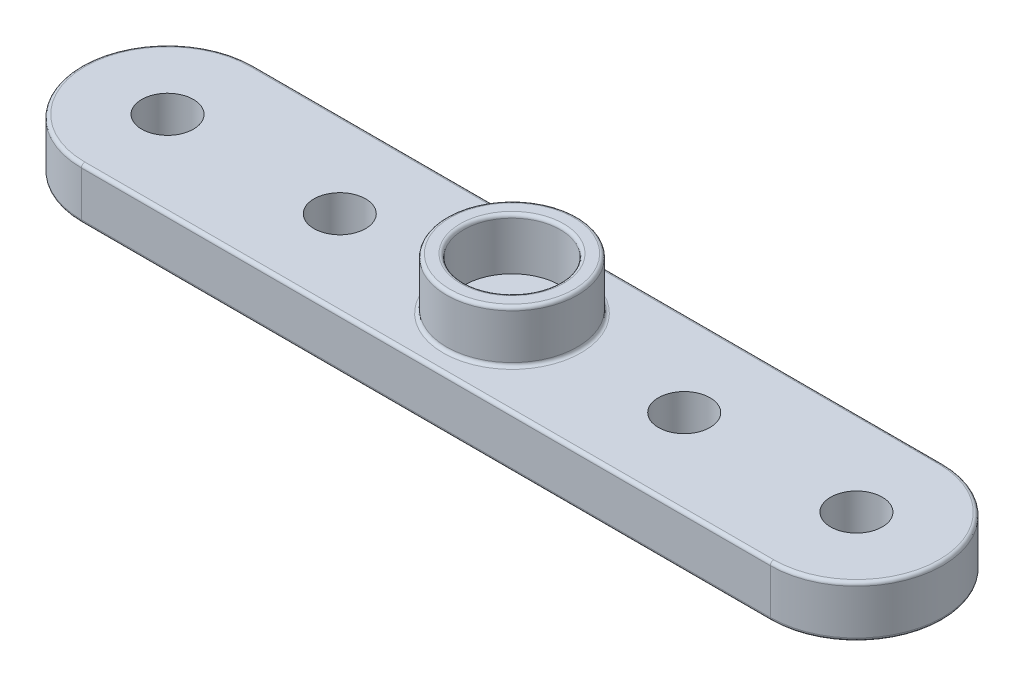
ISO-10303-21;
HEADER;
FILE_DESCRIPTION(('STEP AP214'),'2;1');
FILE_NAME('part.step','',(''),(''),'','','');
FILE_SCHEMA(('AUTOMOTIVE_DESIGN { 1 0 10303 214 1 1 1 1 }'));
ENDSEC;
DATA;
#1=APPLICATION_CONTEXT('core data for automotive mechanical design processes');
#2=APPLICATION_PROTOCOL_DEFINITION('international standard','automotive_design',2000,#1);
#3=PRODUCT_CONTEXT('',#1,'mechanical');
#4=PRODUCT('Part','Part','',(#3));
#5=PRODUCT_RELATED_PRODUCT_CATEGORY('part','',(#4));
#6=PRODUCT_DEFINITION_FORMATION('','',#4);
#7=PRODUCT_DEFINITION_CONTEXT('part definition',#1,'design');
#8=PRODUCT_DEFINITION('design','',#6,#7);
#9=PRODUCT_DEFINITION_SHAPE('','',#8);
#10=(LENGTH_UNIT() NAMED_UNIT(*) SI_UNIT(.MILLI.,.METRE.));
#11=(NAMED_UNIT(*) PLANE_ANGLE_UNIT() SI_UNIT($,.RADIAN.));
#12=(NAMED_UNIT(*) SI_UNIT($,.STERADIAN.) SOLID_ANGLE_UNIT());
#13=UNCERTAINTY_MEASURE_WITH_UNIT(LENGTH_MEASURE(1.E-05),#10,'distance_accuracy_value','');
#14=(GEOMETRIC_REPRESENTATION_CONTEXT(3) GLOBAL_UNCERTAINTY_ASSIGNED_CONTEXT((#13)) GLOBAL_UNIT_ASSIGNED_CONTEXT((#10,
#11,#12)) REPRESENTATION_CONTEXT('',''));
#15=CARTESIAN_POINT('',(0.,0.,0.));
#16=DIRECTION('',(0.,0.,1.));
#17=DIRECTION('',(1.,0.,0.));
#18=AXIS2_PLACEMENT_3D('',#15,#16,#17);
#19=CARTESIAN_POINT('',(20.,0.,0.));
#20=DIRECTION('',(0.,-1.,0.));
#21=DIRECTION('',(0.,0.,-1.));
#22=AXIS2_PLACEMENT_3D('',#19,#20,#21);
#23=CYLINDRICAL_SURFACE('',#22,5.);
#24=DIRECTION('',(0.,-1.,0.));
#25=VECTOR('',#24,1.);
#26=CARTESIAN_POINT('',(20.,3.,-5.));
#27=LINE('',#26,#25);
#28=CARTESIAN_POINT('',(20.,2.8,-5.));
#29=VERTEX_POINT('',#28);
#30=CARTESIAN_POINT('',(20.,0.2,-5.));
#31=VERTEX_POINT('',#30);
#32=EDGE_CURVE('E234',#29,#31,#27,.T.);
#33=ORIENTED_EDGE('',*,*,#32,.F.);
#34=CARTESIAN_POINT('',(20.,2.8,0.));
#35=DIRECTION('',(0.,1.,0.));
#36=DIRECTION('',(0.,0.,1.));
#37=AXIS2_PLACEMENT_3D('',#34,#35,#36);
#38=CIRCLE('',#37,5.);
#39=CARTESIAN_POINT('',(20.,2.8,5.));
#40=VERTEX_POINT('',#39);
#41=EDGE_CURVE('E165',#29,#40,#38,.F.);
#42=ORIENTED_EDGE('',*,*,#41,.T.);
#43=DIRECTION('',(0.,-1.,0.));
#44=VECTOR('',#43,1.);
#45=CARTESIAN_POINT('',(20.,3.,5.));
#46=LINE('',#45,#44);
#47=CARTESIAN_POINT('',(20.,0.2,5.));
#48=VERTEX_POINT('',#47);
#49=EDGE_CURVE('E237',#48,#40,#46,.F.);
#50=ORIENTED_EDGE('',*,*,#49,.F.);
#51=CARTESIAN_POINT('',(20.,0.2,0.));
#52=DIRECTION('',(0.,1.,0.));
#53=DIRECTION('',(0.,0.,1.));
#54=AXIS2_PLACEMENT_3D('',#51,#52,#53);
#55=CIRCLE('',#54,5.);
#56=EDGE_CURVE('E162',#48,#31,#55,.T.);
#57=ORIENTED_EDGE('',*,*,#56,.T.);
#58=EDGE_LOOP('',(#33,#42,#50,#57));
#59=FACE_BOUND('',#58,.T.);
#60=ADVANCED_FACE('F41',(#59),#23,.T.);
#61=CARTESIAN_POINT('',(-20.,0.,0.));
#62=DIRECTION('',(0.,-1.,0.));
#63=DIRECTION('',(0.,0.,-1.));
#64=AXIS2_PLACEMENT_3D('',#61,#62,#63);
#65=CYLINDRICAL_SURFACE('',#64,5.);
#66=DIRECTION('',(0.,-1.,0.));
#67=VECTOR('',#66,1.);
#68=CARTESIAN_POINT('',(-20.,3.,5.));
#69=LINE('',#68,#67);
#70=CARTESIAN_POINT('',(-20.,2.8,5.));
#71=VERTEX_POINT('',#70);
#72=CARTESIAN_POINT('',(-20.,0.2,5.));
#73=VERTEX_POINT('',#72);
#74=EDGE_CURVE('E249',#71,#73,#69,.T.);
#75=ORIENTED_EDGE('',*,*,#74,.F.);
#76=CARTESIAN_POINT('',(-20.,2.8,0.));
#77=DIRECTION('',(0.,1.,0.));
#78=DIRECTION('',(0.,0.,1.));
#79=AXIS2_PLACEMENT_3D('',#76,#77,#78);
#80=CIRCLE('',#79,5.);
#81=CARTESIAN_POINT('',(-20.,2.8,-5.));
#82=VERTEX_POINT('',#81);
#83=EDGE_CURVE('E118',#71,#82,#80,.F.);
#84=ORIENTED_EDGE('',*,*,#83,.T.);
#85=DIRECTION('',(0.,-1.,0.));
#86=VECTOR('',#85,1.);
#87=CARTESIAN_POINT('',(-20.,3.,-5.));
#88=LINE('',#87,#86);
#89=CARTESIAN_POINT('',(-20.,0.2,-5.));
#90=VERTEX_POINT('',#89);
#91=EDGE_CURVE('E261',#90,#82,#88,.F.);
#92=ORIENTED_EDGE('',*,*,#91,.F.);
#93=CARTESIAN_POINT('',(-20.,0.2,0.));
#94=DIRECTION('',(0.,1.,0.));
#95=DIRECTION('',(0.,0.,1.));
#96=AXIS2_PLACEMENT_3D('',#93,#94,#95);
#97=CIRCLE('',#96,5.);
#98=EDGE_CURVE('E146',#90,#73,#97,.T.);
#99=ORIENTED_EDGE('',*,*,#98,.T.);
#100=EDGE_LOOP('',(#75,#84,#92,#99));
#101=FACE_BOUND('',#100,.T.);
#102=ADVANCED_FACE('F260',(#101),#65,.T.);
#103=CARTESIAN_POINT('',(0.,3.,0.));
#104=DIRECTION('',(0.,1.,0.));
#105=DIRECTION('',(0.,0.,1.));
#106=AXIS2_PLACEMENT_3D('',#103,#104,#105);
#107=PLANE('',#106);
#108=CARTESIAN_POINT('',(0.,3.,0.));
#109=DIRECTION('',(0.,1.,0.));
#110=DIRECTION('',(0.,0.,1.));
#111=AXIS2_PLACEMENT_3D('',#108,#109,#110);
#112=CIRCLE('',#111,4.);
#113=CARTESIAN_POINT('',(0.,3.,4.));
#114=VERTEX_POINT('',#113);
#115=EDGE_CURVE('E141',#114,#114,#112,.F.);
#116=ORIENTED_EDGE('',*,*,#115,.T.);
#117=EDGE_LOOP('',(#116));
#118=FACE_BOUND('',#117,.T.);
#119=DIRECTION('',(-1.,0.,0.));
#120=VECTOR('',#119,1.);
#121=CARTESIAN_POINT('',(-20.,3.,-4.8));
#122=LINE('',#121,#120);
#123=CARTESIAN_POINT('',(20.,3.,-4.8));
#124=VERTEX_POINT('',#123);
#125=CARTESIAN_POINT('',(-20.,3.,-4.8));
#126=VERTEX_POINT('',#125);
#127=EDGE_CURVE('E138',#124,#126,#122,.T.);
#128=ORIENTED_EDGE('',*,*,#127,.T.);
#129=CARTESIAN_POINT('',(-20.,3.,0.));
#130=DIRECTION('',(0.,1.,0.));
#131=DIRECTION('',(0.,0.,1.));
#132=AXIS2_PLACEMENT_3D('',#129,#130,#131);
#133=CIRCLE('',#132,4.8);
#134=CARTESIAN_POINT('',(-20.,3.,4.8));
#135=VERTEX_POINT('',#134);
#136=EDGE_CURVE('E116',#126,#135,#133,.T.);
#137=ORIENTED_EDGE('',*,*,#136,.T.);
#138=DIRECTION('',(1.,0.,0.));
#139=VECTOR('',#138,1.);
#140=CARTESIAN_POINT('',(20.,3.,4.8));
#141=LINE('',#140,#139);
#142=CARTESIAN_POINT('',(20.,3.,4.8));
#143=VERTEX_POINT('',#142);
#144=EDGE_CURVE('E125',#135,#143,#141,.T.);
#145=ORIENTED_EDGE('',*,*,#144,.T.);
#146=CARTESIAN_POINT('',(20.,3.,0.));
#147=DIRECTION('',(0.,1.,0.));
#148=DIRECTION('',(0.,0.,1.));
#149=AXIS2_PLACEMENT_3D('',#146,#147,#148);
#150=CIRCLE('',#149,4.8);
#151=EDGE_CURVE('E132',#143,#124,#150,.T.);
#152=ORIENTED_EDGE('',*,*,#151,.T.);
#153=EDGE_LOOP('',(#128,#137,#145,#152));
#154=FACE_BOUND('',#153,.T.);
#155=CARTESIAN_POINT('',(10.,3.,0.));
#156=DIRECTION('',(0.,1.,0.));
#157=DIRECTION('',(0.,0.,-1.));
#158=AXIS2_PLACEMENT_3D('',#155,#156,#157);
#159=CIRCLE('',#158,1.5);
#160=CARTESIAN_POINT('',(10.,3.,-1.5));
#161=VERTEX_POINT('',#160);
#162=EDGE_CURVE('E280',#161,#161,#159,.T.);
#163=ORIENTED_EDGE('',*,*,#162,.F.);
#164=EDGE_LOOP('',(#163));
#165=FACE_BOUND('',#164,.T.);
#166=CARTESIAN_POINT('',(-10.,3.,0.));
#167=DIRECTION('',(0.,1.,0.));
#168=DIRECTION('',(0.,0.,1.));
#169=AXIS2_PLACEMENT_3D('',#166,#167,#168);
#170=CIRCLE('',#169,1.5);
#171=CARTESIAN_POINT('',(-10.,3.,1.5));
#172=VERTEX_POINT('',#171);
#173=EDGE_CURVE('E264',#172,#172,#170,.T.);
#174=ORIENTED_EDGE('',*,*,#173,.F.);
#175=EDGE_LOOP('',(#174));
#176=FACE_BOUND('',#175,.T.);
#177=CARTESIAN_POINT('',(-20.,3.,0.));
#178=DIRECTION('',(0.,1.,0.));
#179=DIRECTION('',(0.,0.,1.));
#180=AXIS2_PLACEMENT_3D('',#177,#178,#179);
#181=CIRCLE('',#180,1.5);
#182=CARTESIAN_POINT('',(-20.,3.,1.5));
#183=VERTEX_POINT('',#182);
#184=EDGE_CURVE('E274',#183,#183,#181,.T.);
#185=ORIENTED_EDGE('',*,*,#184,.F.);
#186=EDGE_LOOP('',(#185));
#187=FACE_BOUND('',#186,.T.);
#188=CARTESIAN_POINT('',(20.,3.,0.));
#189=DIRECTION('',(0.,1.,0.));
#190=DIRECTION('',(0.,0.,-1.));
#191=AXIS2_PLACEMENT_3D('',#188,#189,#190);
#192=CIRCLE('',#191,1.5);
#193=CARTESIAN_POINT('',(20.,3.,-1.5));
#194=VERTEX_POINT('',#193);
#195=EDGE_CURVE('E288',#194,#194,#192,.T.);
#196=ORIENTED_EDGE('',*,*,#195,.F.);
#197=EDGE_LOOP('',(#196));
#198=FACE_BOUND('',#197,.T.);
#199=ADVANCED_FACE('F135',(#118,#154,#165,#176,#187,#198),#107,.T.);
#200=CARTESIAN_POINT('',(0.,0.,0.));
#201=DIRECTION('',(0.,1.,0.));
#202=DIRECTION('',(0.,0.,1.));
#203=AXIS2_PLACEMENT_3D('',#200,#201,#202);
#204=PLANE('',#203);
#205=DIRECTION('',(1.,0.,0.));
#206=VECTOR('',#205,1.);
#207=CARTESIAN_POINT('',(0.,0.,4.8));
#208=LINE('',#207,#206);
#209=CARTESIAN_POINT('',(20.,0.,4.8));
#210=VERTEX_POINT('',#209);
#211=CARTESIAN_POINT('',(-20.,0.,4.8));
#212=VERTEX_POINT('',#211);
#213=EDGE_CURVE('E168',#210,#212,#208,.F.);
#214=ORIENTED_EDGE('',*,*,#213,.T.);
#215=CARTESIAN_POINT('',(-20.,0.,0.));
#216=DIRECTION('',(0.,1.,0.));
#217=DIRECTION('',(0.,0.,1.));
#218=AXIS2_PLACEMENT_3D('',#215,#216,#217);
#219=CIRCLE('',#218,4.8);
#220=CARTESIAN_POINT('',(-20.,0.,-4.8));
#221=VERTEX_POINT('',#220);
#222=EDGE_CURVE('E176',#212,#221,#219,.F.);
#223=ORIENTED_EDGE('',*,*,#222,.T.);
#224=DIRECTION('',(-1.,0.,0.));
#225=VECTOR('',#224,1.);
#226=CARTESIAN_POINT('',(0.,0.,-4.8));
#227=LINE('',#226,#225);
#228=CARTESIAN_POINT('',(20.,0.,-4.8));
#229=VERTEX_POINT('',#228);
#230=EDGE_CURVE('E66',#221,#229,#227,.F.);
#231=ORIENTED_EDGE('',*,*,#230,.T.);
#232=CARTESIAN_POINT('',(20.,0.,0.));
#233=DIRECTION('',(0.,1.,0.));
#234=DIRECTION('',(0.,0.,1.));
#235=AXIS2_PLACEMENT_3D('',#232,#233,#234);
#236=CIRCLE('',#235,4.8);
#237=EDGE_CURVE('E171',#229,#210,#236,.F.);
#238=ORIENTED_EDGE('',*,*,#237,.T.);
#239=EDGE_LOOP('',(#214,#223,#231,#238));
#240=FACE_BOUND('',#239,.T.);
#241=CARTESIAN_POINT('',(-10.,0.,0.));
#242=DIRECTION('',(0.,1.,0.));
#243=DIRECTION('',(0.,0.,1.));
#244=AXIS2_PLACEMENT_3D('',#241,#242,#243);
#245=CIRCLE('',#244,1.5);
#246=CARTESIAN_POINT('',(-10.,0.,1.5));
#247=VERTEX_POINT('',#246);
#248=EDGE_CURVE('E269',#247,#247,#245,.T.);
#249=ORIENTED_EDGE('',*,*,#248,.T.);
#250=EDGE_LOOP('',(#249));
#251=FACE_BOUND('',#250,.T.);
#252=CARTESIAN_POINT('',(-20.,0.,0.));
#253=DIRECTION('',(0.,1.,0.));
#254=DIRECTION('',(0.,0.,1.));
#255=AXIS2_PLACEMENT_3D('',#252,#253,#254);
#256=CIRCLE('',#255,1.5);
#257=CARTESIAN_POINT('',(-20.,0.,1.5));
#258=VERTEX_POINT('',#257);
#259=EDGE_CURVE('E276',#258,#258,#256,.T.);
#260=ORIENTED_EDGE('',*,*,#259,.T.);
#261=EDGE_LOOP('',(#260));
#262=FACE_BOUND('',#261,.T.);
#263=CARTESIAN_POINT('',(10.,0.,0.));
#264=DIRECTION('',(0.,1.,0.));
#265=DIRECTION('',(0.,0.,-1.));
#266=AXIS2_PLACEMENT_3D('',#263,#264,#265);
#267=CIRCLE('',#266,1.5);
#268=CARTESIAN_POINT('',(10.,0.,-1.5));
#269=VERTEX_POINT('',#268);
#270=EDGE_CURVE('E284',#269,#269,#267,.T.);
#271=ORIENTED_EDGE('',*,*,#270,.T.);
#272=EDGE_LOOP('',(#271));
#273=FACE_BOUND('',#272,.T.);
#274=CARTESIAN_POINT('',(20.,0.,0.));
#275=DIRECTION('',(0.,1.,0.));
#276=DIRECTION('',(0.,0.,-1.));
#277=AXIS2_PLACEMENT_3D('',#274,#275,#276);
#278=CIRCLE('',#277,1.5);
#279=CARTESIAN_POINT('',(20.,0.,-1.5));
#280=VERTEX_POINT('',#279);
#281=EDGE_CURVE('E208',#280,#280,#278,.T.);
#282=ORIENTED_EDGE('',*,*,#281,.T.);
#283=EDGE_LOOP('',(#282));
#284=FACE_BOUND('',#283,.T.);
#285=ADVANCED_FACE('F303',(#240,#251,#262,#273,#284),#204,.F.);
#286=CARTESIAN_POINT('',(-25.,3.,5.));
#287=DIRECTION('',(0.,0.,-1.));
#288=DIRECTION('',(-1.,0.,0.));
#289=AXIS2_PLACEMENT_3D('',#286,#287,#288);
#290=PLANE('',#289);
#291=ORIENTED_EDGE('',*,*,#49,.T.);
#292=DIRECTION('',(1.,0.,0.));
#293=VECTOR('',#292,1.);
#294=CARTESIAN_POINT('',(-20.,2.8,5.));
#295=LINE('',#294,#293);
#296=EDGE_CURVE('E190',#40,#71,#295,.F.);
#297=ORIENTED_EDGE('',*,*,#296,.T.);
#298=ORIENTED_EDGE('',*,*,#74,.T.);
#299=DIRECTION('',(1.,0.,0.));
#300=VECTOR('',#299,1.);
#301=CARTESIAN_POINT('',(-25.,0.2,5.));
#302=LINE('',#301,#300);
#303=EDGE_CURVE('E187',#73,#48,#302,.T.);
#304=ORIENTED_EDGE('',*,*,#303,.T.);
#305=EDGE_LOOP('',(#291,#297,#298,#304));
#306=FACE_BOUND('',#305,.T.);
#307=ADVANCED_FACE('F311',(#306),#290,.F.);
#308=CARTESIAN_POINT('',(-25.,3.,-5.));
#309=DIRECTION('',(0.,0.,1.));
#310=DIRECTION('',(1.,0.,0.));
#311=AXIS2_PLACEMENT_3D('',#308,#309,#310);
#312=PLANE('',#311);
#313=ORIENTED_EDGE('',*,*,#91,.T.);
#314=DIRECTION('',(-1.,0.,0.));
#315=VECTOR('',#314,1.);
#316=CARTESIAN_POINT('',(20.,2.8,-5.));
#317=LINE('',#316,#315);
#318=EDGE_CURVE('E159',#82,#29,#317,.F.);
#319=ORIENTED_EDGE('',*,*,#318,.T.);
#320=ORIENTED_EDGE('',*,*,#32,.T.);
#321=DIRECTION('',(-1.,0.,0.));
#322=VECTOR('',#321,1.);
#323=CARTESIAN_POINT('',(-25.,0.2,-5.));
#324=LINE('',#323,#322);
#325=EDGE_CURVE('E156',#31,#90,#324,.T.);
#326=ORIENTED_EDGE('',*,*,#325,.T.);
#327=EDGE_LOOP('',(#313,#319,#320,#326));
#328=FACE_BOUND('',#327,.T.);
#329=ADVANCED_FACE('F240',(#328),#312,.F.);
#330=CARTESIAN_POINT('',(-10.,3.,0.));
#331=DIRECTION('',(0.,-1.,0.));
#332=DIRECTION('',(0.,0.,-1.));
#333=AXIS2_PLACEMENT_3D('',#330,#331,#332);
#334=CYLINDRICAL_SURFACE('',#333,1.5);
#335=ORIENTED_EDGE('',*,*,#173,.T.);
#336=EDGE_LOOP('',(#335));
#337=FACE_BOUND('',#336,.T.);
#338=ORIENTED_EDGE('',*,*,#248,.F.);
#339=EDGE_LOOP('',(#338));
#340=FACE_BOUND('',#339,.T.);
#341=ADVANCED_FACE('F383',(#337,#340),#334,.F.);
#342=CARTESIAN_POINT('',(-20.,3.,0.));
#343=DIRECTION('',(0.,-1.,0.));
#344=DIRECTION('',(0.,0.,-1.));
#345=AXIS2_PLACEMENT_3D('',#342,#343,#344);
#346=CYLINDRICAL_SURFACE('',#345,1.5);
#347=ORIENTED_EDGE('',*,*,#184,.T.);
#348=EDGE_LOOP('',(#347));
#349=FACE_BOUND('',#348,.T.);
#350=ORIENTED_EDGE('',*,*,#259,.F.);
#351=EDGE_LOOP('',(#350));
#352=FACE_BOUND('',#351,.T.);
#353=ADVANCED_FACE('F380',(#349,#352),#346,.F.);
#354=CARTESIAN_POINT('',(10.,3.,0.));
#355=DIRECTION('',(0.,-1.,0.));
#356=DIRECTION('',(0.,0.,-1.));
#357=AXIS2_PLACEMENT_3D('',#354,#355,#356);
#358=CYLINDRICAL_SURFACE('',#357,1.5);
#359=ORIENTED_EDGE('',*,*,#162,.T.);
#360=EDGE_LOOP('',(#359));
#361=FACE_BOUND('',#360,.T.);
#362=ORIENTED_EDGE('',*,*,#270,.F.);
#363=EDGE_LOOP('',(#362));
#364=FACE_BOUND('',#363,.T.);
#365=ADVANCED_FACE('F377',(#361,#364),#358,.F.);
#366=CARTESIAN_POINT('',(20.,3.,0.));
#367=DIRECTION('',(0.,-1.,0.));
#368=DIRECTION('',(0.,0.,-1.));
#369=AXIS2_PLACEMENT_3D('',#366,#367,#368);
#370=CYLINDRICAL_SURFACE('',#369,1.5);
#371=ORIENTED_EDGE('',*,*,#195,.T.);
#372=EDGE_LOOP('',(#371));
#373=FACE_BOUND('',#372,.T.);
#374=ORIENTED_EDGE('',*,*,#281,.F.);
#375=EDGE_LOOP('',(#374));
#376=FACE_BOUND('',#375,.T.);
#377=ADVANCED_FACE('F299',(#373,#376),#370,.F.);
#378=CARTESIAN_POINT('',(0.,6.,0.));
#379=DIRECTION('',(0.,1.,0.));
#380=DIRECTION('',(0.,0.,1.));
#381=AXIS2_PLACEMENT_3D('',#378,#379,#380);
#382=PLANE('',#381);
#383=CARTESIAN_POINT('',(0.,6.,0.));
#384=DIRECTION('',(0.,1.,0.));
#385=DIRECTION('',(0.,0.,1.));
#386=AXIS2_PLACEMENT_3D('',#383,#384,#385);
#387=CIRCLE('',#386,3.);
#388=CARTESIAN_POINT('',(0.,6.,3.));
#389=VERTEX_POINT('',#388);
#390=EDGE_CURVE('E11',#389,#389,#387,.F.);
#391=ORIENTED_EDGE('',*,*,#390,.T.);
#392=EDGE_LOOP('',(#391));
#393=FACE_BOUND('',#392,.T.);
#394=CARTESIAN_POINT('',(0.,6.,0.));
#395=DIRECTION('',(0.,1.,0.));
#396=DIRECTION('',(0.,0.,1.));
#397=AXIS2_PLACEMENT_3D('',#394,#395,#396);
#398=CIRCLE('',#397,3.6);
#399=CARTESIAN_POINT('',(0.,6.,3.6));
#400=VERTEX_POINT('',#399);
#401=EDGE_CURVE('E51',#400,#400,#398,.T.);
#402=ORIENTED_EDGE('',*,*,#401,.T.);
#403=EDGE_LOOP('',(#402));
#404=FACE_BOUND('',#403,.T.);
#405=ADVANCED_FACE('F368',(#393,#404),#382,.T.);
#406=CARTESIAN_POINT('',(0.,6.,0.));
#407=DIRECTION('',(0.,-1.,0.));
#408=DIRECTION('',(0.,0.,-1.));
#409=AXIS2_PLACEMENT_3D('',#406,#407,#408);
#410=CYLINDRICAL_SURFACE('',#409,3.8);
#411=CARTESIAN_POINT('',(0.,3.2,0.));
#412=DIRECTION('',(0.,1.,0.));
#413=DIRECTION('',(0.,0.,1.));
#414=AXIS2_PLACEMENT_3D('',#411,#412,#413);
#415=CIRCLE('',#414,3.8);
#416=CARTESIAN_POINT('',(0.,3.2,3.8));
#417=VERTEX_POINT('',#416);
#418=EDGE_CURVE('E183',#417,#417,#415,.T.);
#419=ORIENTED_EDGE('',*,*,#418,.T.);
#420=EDGE_LOOP('',(#419));
#421=FACE_BOUND('',#420,.T.);
#422=CARTESIAN_POINT('',(0.,5.8,0.));
#423=DIRECTION('',(0.,1.,0.));
#424=DIRECTION('',(0.,0.,1.));
#425=AXIS2_PLACEMENT_3D('',#422,#423,#424);
#426=CIRCLE('',#425,3.8);
#427=CARTESIAN_POINT('',(0.,5.8,3.8));
#428=VERTEX_POINT('',#427);
#429=EDGE_CURVE('E179',#428,#428,#426,.F.);
#430=ORIENTED_EDGE('',*,*,#429,.T.);
#431=EDGE_LOOP('',(#430));
#432=FACE_BOUND('',#431,.T.);
#433=ADVANCED_FACE('F362',(#421,#432),#410,.T.);
#434=CARTESIAN_POINT('',(0.,6.,0.));
#435=DIRECTION('',(0.,-1.,0.));
#436=DIRECTION('',(0.,0.,-1.));
#437=AXIS2_PLACEMENT_3D('',#434,#435,#436);
#438=CYLINDRICAL_SURFACE('',#437,2.8);
#439=CARTESIAN_POINT('',(0.,5.8,0.));
#440=DIRECTION('',(0.,1.,0.));
#441=DIRECTION('',(0.,0.,1.));
#442=AXIS2_PLACEMENT_3D('',#439,#440,#441);
#443=CIRCLE('',#442,2.8);
#444=CARTESIAN_POINT('',(0.,5.8,2.8));
#445=VERTEX_POINT('',#444);
#446=EDGE_CURVE('E193',#445,#445,#443,.T.);
#447=ORIENTED_EDGE('',*,*,#446,.T.);
#448=EDGE_LOOP('',(#447));
#449=FACE_BOUND('',#448,.T.);
#450=CARTESIAN_POINT('',(0.,3.,0.));
#451=DIRECTION('',(0.,1.,0.));
#452=DIRECTION('',(0.,0.,1.));
#453=AXIS2_PLACEMENT_3D('',#450,#451,#452);
#454=CIRCLE('',#453,2.8);
#455=CARTESIAN_POINT('',(0.,3.,2.8));
#456=VERTEX_POINT('',#455);
#457=EDGE_CURVE('E133',#456,#456,#454,.F.);
#458=ORIENTED_EDGE('',*,*,#457,.T.);
#459=EDGE_LOOP('',(#458));
#460=FACE_BOUND('',#459,.T.);
#461=ADVANCED_FACE('F316',(#449,#460),#438,.F.);
#462=ORIENTED_EDGE('',*,*,#457,.F.);
#463=EDGE_LOOP('',(#462));
#464=FACE_BOUND('',#463,.T.);
#465=ADVANCED_FACE('F306',(#464),#107,.T.);
#466=CARTESIAN_POINT('',(20.,2.8,0.));
#467=DIRECTION('',(0.,1.,0.));
#468=DIRECTION('',(0.,0.,1.));
#469=AXIS2_PLACEMENT_3D('',#466,#467,#468);
#470=TOROIDAL_SURFACE('',#469,4.8,0.2);
#471=CARTESIAN_POINT('',(20.,2.8,4.8));
#472=DIRECTION('',(-1.,0.,0.));
#473=DIRECTION('',(0.,0.,1.));
#474=AXIS2_PLACEMENT_3D('',#471,#472,#473);
#475=CIRCLE('',#474,0.2);
#476=EDGE_CURVE('E128',#40,#143,#475,.T.);
#477=ORIENTED_EDGE('',*,*,#476,.F.);
#478=ORIENTED_EDGE('',*,*,#41,.F.);
#479=CARTESIAN_POINT('',(20.,2.8,-4.8));
#480=DIRECTION('',(-1.,0.,0.));
#481=DIRECTION('',(0.,0.,1.));
#482=AXIS2_PLACEMENT_3D('',#479,#480,#481);
#483=CIRCLE('',#482,0.2);
#484=EDGE_CURVE('E204',#124,#29,#483,.T.);
#485=ORIENTED_EDGE('',*,*,#484,.F.);
#486=ORIENTED_EDGE('',*,*,#151,.F.);
#487=EDGE_LOOP('',(#477,#478,#485,#486));
#488=FACE_BOUND('',#487,.T.);
#489=ADVANCED_FACE('F255',(#488),#470,.T.);
#490=CARTESIAN_POINT('',(0.,2.8,-4.8));
#491=DIRECTION('',(1.,0.,0.));
#492=DIRECTION('',(0.,0.,-1.));
#493=AXIS2_PLACEMENT_3D('',#490,#491,#492);
#494=CYLINDRICAL_SURFACE('',#493,0.2);
#495=ORIENTED_EDGE('',*,*,#484,.T.);
#496=ORIENTED_EDGE('',*,*,#318,.F.);
#497=CARTESIAN_POINT('',(-20.,2.8,-4.8));
#498=DIRECTION('',(-1.,0.,0.));
#499=DIRECTION('',(0.,0.,1.));
#500=AXIS2_PLACEMENT_3D('',#497,#498,#499);
#501=CIRCLE('',#500,0.2);
#502=EDGE_CURVE('E122',#126,#82,#501,.T.);
#503=ORIENTED_EDGE('',*,*,#502,.F.);
#504=ORIENTED_EDGE('',*,*,#127,.F.);
#505=EDGE_LOOP('',(#495,#496,#503,#504));
#506=FACE_BOUND('',#505,.T.);
#507=ADVANCED_FACE('F257',(#506),#494,.T.);
#508=CARTESIAN_POINT('',(0.,2.8,4.8));
#509=DIRECTION('',(-1.,0.,0.));
#510=DIRECTION('',(0.,0.,1.));
#511=AXIS2_PLACEMENT_3D('',#508,#509,#510);
#512=CYLINDRICAL_SURFACE('',#511,0.2);
#513=ORIENTED_EDGE('',*,*,#476,.T.);
#514=ORIENTED_EDGE('',*,*,#144,.F.);
#515=CARTESIAN_POINT('',(-20.,2.8,4.8));
#516=DIRECTION('',(-1.,0.,0.));
#517=DIRECTION('',(0.,0.,1.));
#518=AXIS2_PLACEMENT_3D('',#515,#516,#517);
#519=CIRCLE('',#518,0.2);
#520=EDGE_CURVE('E112',#71,#135,#519,.T.);
#521=ORIENTED_EDGE('',*,*,#520,.F.);
#522=ORIENTED_EDGE('',*,*,#296,.F.);
#523=EDGE_LOOP('',(#513,#514,#521,#522));
#524=FACE_BOUND('',#523,.T.);
#525=ADVANCED_FACE('F126',(#524),#512,.T.);
#526=CARTESIAN_POINT('',(-20.,2.8,0.));
#527=DIRECTION('',(0.,1.,0.));
#528=DIRECTION('',(0.,0.,1.));
#529=AXIS2_PLACEMENT_3D('',#526,#527,#528);
#530=TOROIDAL_SURFACE('',#529,4.8,0.2);
#531=ORIENTED_EDGE('',*,*,#502,.T.);
#532=ORIENTED_EDGE('',*,*,#83,.F.);
#533=ORIENTED_EDGE('',*,*,#520,.T.);
#534=ORIENTED_EDGE('',*,*,#136,.F.);
#535=EDGE_LOOP('',(#531,#532,#533,#534));
#536=FACE_BOUND('',#535,.T.);
#537=ADVANCED_FACE('F114',(#536),#530,.T.);
#538=CARTESIAN_POINT('',(20.,0.2,0.));
#539=DIRECTION('',(0.,1.,0.));
#540=DIRECTION('',(0.,0.,1.));
#541=AXIS2_PLACEMENT_3D('',#538,#539,#540);
#542=TOROIDAL_SURFACE('',#541,4.8,0.2);
#543=CARTESIAN_POINT('',(20.,0.2,-4.8));
#544=DIRECTION('',(-1.,0.,0.));
#545=DIRECTION('',(0.,0.,1.));
#546=AXIS2_PLACEMENT_3D('',#543,#544,#545);
#547=CIRCLE('',#546,0.2);
#548=EDGE_CURVE('E213',#31,#229,#547,.T.);
#549=ORIENTED_EDGE('',*,*,#548,.F.);
#550=ORIENTED_EDGE('',*,*,#56,.F.);
#551=CARTESIAN_POINT('',(20.,0.2,4.8));
#552=DIRECTION('',(-1.,0.,0.));
#553=DIRECTION('',(0.,0.,1.));
#554=AXIS2_PLACEMENT_3D('',#551,#552,#553);
#555=CIRCLE('',#554,0.2);
#556=EDGE_CURVE('E45',#210,#48,#555,.T.);
#557=ORIENTED_EDGE('',*,*,#556,.F.);
#558=ORIENTED_EDGE('',*,*,#237,.F.);
#559=EDGE_LOOP('',(#549,#550,#557,#558));
#560=FACE_BOUND('',#559,.T.);
#561=ADVANCED_FACE('F229',(#560),#542,.T.);
#562=CARTESIAN_POINT('',(-25.,0.2,4.8));
#563=DIRECTION('',(1.,0.,0.));
#564=DIRECTION('',(0.,0.,-1.));
#565=AXIS2_PLACEMENT_3D('',#562,#563,#564);
#566=CYLINDRICAL_SURFACE('',#565,0.2);
#567=ORIENTED_EDGE('',*,*,#556,.T.);
#568=ORIENTED_EDGE('',*,*,#303,.F.);
#569=CARTESIAN_POINT('',(-20.,0.2,4.8));
#570=DIRECTION('',(-1.,0.,0.));
#571=DIRECTION('',(0.,0.,1.));
#572=AXIS2_PLACEMENT_3D('',#569,#570,#571);
#573=CIRCLE('',#572,0.2);
#574=EDGE_CURVE('E211',#212,#73,#573,.T.);
#575=ORIENTED_EDGE('',*,*,#574,.F.);
#576=ORIENTED_EDGE('',*,*,#213,.F.);
#577=EDGE_LOOP('',(#567,#568,#575,#576));
#578=FACE_BOUND('',#577,.T.);
#579=ADVANCED_FACE('F225',(#578),#566,.T.);
#580=CARTESIAN_POINT('',(-25.,0.2,-4.8));
#581=DIRECTION('',(-1.,0.,0.));
#582=DIRECTION('',(0.,0.,1.));
#583=AXIS2_PLACEMENT_3D('',#580,#581,#582);
#584=CYLINDRICAL_SURFACE('',#583,0.2);
#585=ORIENTED_EDGE('',*,*,#548,.T.);
#586=ORIENTED_EDGE('',*,*,#230,.F.);
#587=CARTESIAN_POINT('',(-20.,0.2,-4.8));
#588=DIRECTION('',(-1.,0.,0.));
#589=DIRECTION('',(0.,0.,1.));
#590=AXIS2_PLACEMENT_3D('',#587,#588,#589);
#591=CIRCLE('',#590,0.2);
#592=EDGE_CURVE('E59',#90,#221,#591,.T.);
#593=ORIENTED_EDGE('',*,*,#592,.F.);
#594=ORIENTED_EDGE('',*,*,#325,.F.);
#595=EDGE_LOOP('',(#585,#586,#593,#594));
#596=FACE_BOUND('',#595,.T.);
#597=ADVANCED_FACE('F340',(#596),#584,.T.);
#598=CARTESIAN_POINT('',(-20.,0.2,0.));
#599=DIRECTION('',(0.,1.,0.));
#600=DIRECTION('',(0.,0.,1.));
#601=AXIS2_PLACEMENT_3D('',#598,#599,#600);
#602=TOROIDAL_SURFACE('',#601,4.8,0.2);
#603=ORIENTED_EDGE('',*,*,#574,.T.);
#604=ORIENTED_EDGE('',*,*,#98,.F.);
#605=ORIENTED_EDGE('',*,*,#592,.T.);
#606=ORIENTED_EDGE('',*,*,#222,.F.);
#607=EDGE_LOOP('',(#603,#604,#605,#606));
#608=FACE_BOUND('',#607,.T.);
#609=ADVANCED_FACE('F336',(#608),#602,.T.);
#610=CARTESIAN_POINT('',(0.,3.2,0.));
#611=DIRECTION('',(0.,1.,0.));
#612=DIRECTION('',(0.,0.,1.));
#613=AXIS2_PLACEMENT_3D('',#610,#611,#612);
#614=TOROIDAL_SURFACE('',#613,4.,0.2);
#615=ORIENTED_EDGE('',*,*,#115,.F.);
#616=EDGE_LOOP('',(#615));
#617=FACE_BOUND('',#616,.T.);
#618=ORIENTED_EDGE('',*,*,#418,.F.);
#619=EDGE_LOOP('',(#618));
#620=FACE_BOUND('',#619,.T.);
#621=ADVANCED_FACE('F339',(#617,#620),#614,.F.);
#622=CARTESIAN_POINT('',(0.,5.8,0.));
#623=DIRECTION('',(0.,1.,0.));
#624=DIRECTION('',(0.,0.,1.));
#625=AXIS2_PLACEMENT_3D('',#622,#623,#624);
#626=TOROIDAL_SURFACE('',#625,3.,0.2);
#627=ORIENTED_EDGE('',*,*,#390,.F.);
#628=EDGE_LOOP('',(#627));
#629=FACE_BOUND('',#628,.T.);
#630=ORIENTED_EDGE('',*,*,#446,.F.);
#631=EDGE_LOOP('',(#630));
#632=FACE_BOUND('',#631,.T.);
#633=ADVANCED_FACE('F348',(#629,#632),#626,.T.);
#634=CARTESIAN_POINT('',(0.,5.8,0.));
#635=DIRECTION('',(0.,1.,0.));
#636=DIRECTION('',(0.,0.,1.));
#637=AXIS2_PLACEMENT_3D('',#634,#635,#636);
#638=TOROIDAL_SURFACE('',#637,3.6,0.2);
#639=ORIENTED_EDGE('',*,*,#429,.F.);
#640=EDGE_LOOP('',(#639));
#641=FACE_BOUND('',#640,.T.);
#642=ORIENTED_EDGE('',*,*,#401,.F.);
#643=EDGE_LOOP('',(#642));
#644=FACE_BOUND('',#643,.T.);
#645=ADVANCED_FACE('F43',(#641,#644),#638,.T.);
#646=CLOSED_SHELL('',(#60,#102,#199,#285,#307,#329,#341,#353,#365,#377,#405,#433,#461,#465,#489,
#507,#525,#537,#561,#579,#597,#609,#621,#633,#645));
#647=MANIFOLD_SOLID_BREP('B2',#646);
#648=ADVANCED_BREP_SHAPE_REPRESENTATION('',(#18,#647),#14);
#649=SHAPE_DEFINITION_REPRESENTATION(#9,#648);
ENDSEC;
END-ISO-10303-21;
